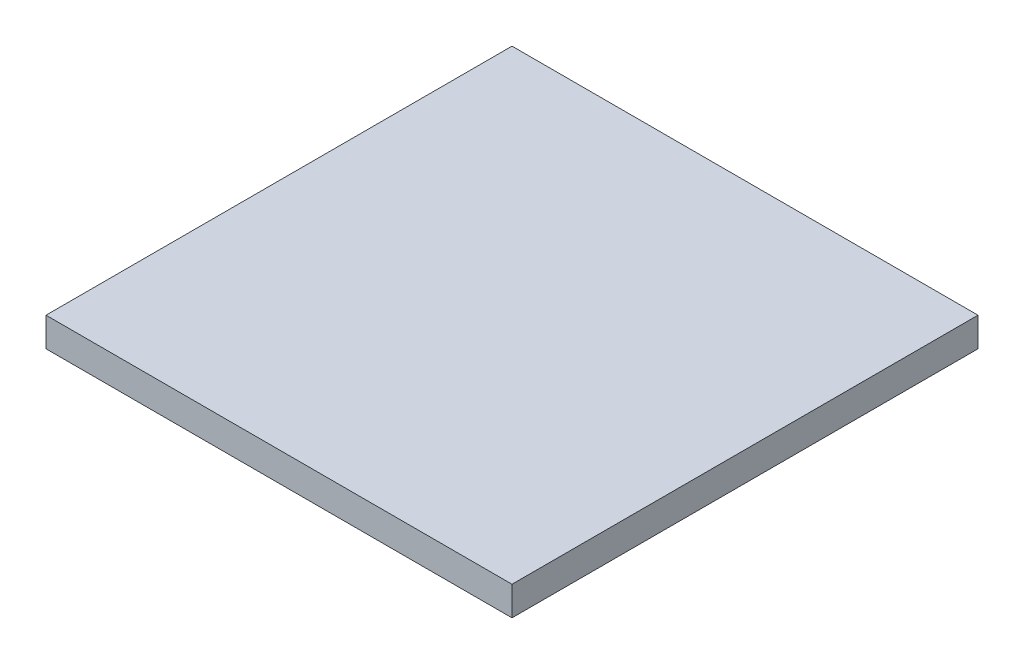
ISO-10303-21;
HEADER;
FILE_DESCRIPTION(('STEP AP214'),'2;1');
FILE_NAME('part.step','',(''),(''),'','','');
FILE_SCHEMA(('AUTOMOTIVE_DESIGN { 1 0 10303 214 1 1 1 1 }'));
ENDSEC;
DATA;
#1=APPLICATION_CONTEXT('core data for automotive mechanical design processes');
#2=APPLICATION_PROTOCOL_DEFINITION('international standard','automotive_design',2000,#1);
#3=PRODUCT_CONTEXT('',#1,'mechanical');
#4=PRODUCT('Part','Part','',(#3));
#5=PRODUCT_RELATED_PRODUCT_CATEGORY('part','',(#4));
#6=PRODUCT_DEFINITION_FORMATION('','',#4);
#7=PRODUCT_DEFINITION_CONTEXT('part definition',#1,'design');
#8=PRODUCT_DEFINITION('design','',#6,#7);
#9=PRODUCT_DEFINITION_SHAPE('','',#8);
#10=(LENGTH_UNIT() NAMED_UNIT(*) SI_UNIT(.MILLI.,.METRE.));
#11=(NAMED_UNIT(*) PLANE_ANGLE_UNIT() SI_UNIT($,.RADIAN.));
#12=(NAMED_UNIT(*) SI_UNIT($,.STERADIAN.) SOLID_ANGLE_UNIT());
#13=UNCERTAINTY_MEASURE_WITH_UNIT(LENGTH_MEASURE(1.E-05),#10,'distance_accuracy_value','');
#14=(GEOMETRIC_REPRESENTATION_CONTEXT(3) GLOBAL_UNCERTAINTY_ASSIGNED_CONTEXT((#13)) GLOBAL_UNIT_ASSIGNED_CONTEXT((#10,
#11,#12)) REPRESENTATION_CONTEXT('',''));
#15=CARTESIAN_POINT('',(0.,0.,0.));
#16=DIRECTION('',(0.,0.,1.));
#17=DIRECTION('',(1.,0.,0.));
#18=AXIS2_PLACEMENT_3D('',#15,#16,#17);
#19=CARTESIAN_POINT('',(-80.,-10.,80.));
#20=DIRECTION('',(-1.,0.,0.));
#21=DIRECTION('',(0.,0.,1.));
#22=AXIS2_PLACEMENT_3D('',#19,#20,#21);
#23=PLANE('',#22);
#24=DIRECTION('',(0.,0.,1.));
#25=VECTOR('',#24,1.);
#26=CARTESIAN_POINT('',(-80.,0.,80.));
#27=LINE('',#26,#25);
#28=CARTESIAN_POINT('',(-80.,0.,-80.));
#29=VERTEX_POINT('',#28);
#30=CARTESIAN_POINT('',(-80.,0.,80.));
#31=VERTEX_POINT('',#30);
#32=EDGE_CURVE('E103',#29,#31,#27,.T.);
#33=ORIENTED_EDGE('',*,*,#32,.F.);
#34=DIRECTION('',(0.,1.,0.));
#35=VECTOR('',#34,1.);
#36=CARTESIAN_POINT('',(-80.,-10.,-80.));
#37=LINE('',#36,#35);
#38=CARTESIAN_POINT('',(-80.,-10.,-80.));
#39=VERTEX_POINT('',#38);
#40=EDGE_CURVE('E11',#39,#29,#37,.T.);
#41=ORIENTED_EDGE('',*,*,#40,.F.);
#42=DIRECTION('',(0.,0.,1.));
#43=VECTOR('',#42,1.);
#44=CARTESIAN_POINT('',(-80.,-10.,80.));
#45=LINE('',#44,#43);
#46=CARTESIAN_POINT('',(-80.,-10.,80.));
#47=VERTEX_POINT('',#46);
#48=EDGE_CURVE('E97',#39,#47,#45,.T.);
#49=ORIENTED_EDGE('',*,*,#48,.T.);
#50=DIRECTION('',(0.,1.,0.));
#51=VECTOR('',#50,1.);
#52=CARTESIAN_POINT('',(-80.,-10.,80.));
#53=LINE('',#52,#51);
#54=EDGE_CURVE('E42',#47,#31,#53,.T.);
#55=ORIENTED_EDGE('',*,*,#54,.T.);
#56=EDGE_LOOP('',(#33,#41,#49,#55));
#57=FACE_BOUND('',#56,.T.);
#58=ADVANCED_FACE('F39',(#57),#23,.T.);
#59=CARTESIAN_POINT('',(80.,-10.,-80.));
#60=DIRECTION('',(0.,0.,-1.));
#61=DIRECTION('',(-1.,0.,0.));
#62=AXIS2_PLACEMENT_3D('',#59,#60,#61);
#63=PLANE('',#62);
#64=DIRECTION('',(-1.,0.,0.));
#65=VECTOR('',#64,1.);
#66=CARTESIAN_POINT('',(80.,0.,-80.));
#67=LINE('',#66,#65);
#68=CARTESIAN_POINT('',(80.,0.,-80.));
#69=VERTEX_POINT('',#68);
#70=EDGE_CURVE('E99',#69,#29,#67,.T.);
#71=ORIENTED_EDGE('',*,*,#70,.F.);
#72=DIRECTION('',(0.,1.,0.));
#73=VECTOR('',#72,1.);
#74=CARTESIAN_POINT('',(80.,-10.,-80.));
#75=LINE('',#74,#73);
#76=CARTESIAN_POINT('',(80.,-10.,-80.));
#77=VERTEX_POINT('',#76);
#78=EDGE_CURVE('E48',#77,#69,#75,.T.);
#79=ORIENTED_EDGE('',*,*,#78,.F.);
#80=DIRECTION('',(-1.,0.,0.));
#81=VECTOR('',#80,1.);
#82=CARTESIAN_POINT('',(80.,-10.,-80.));
#83=LINE('',#82,#81);
#84=EDGE_CURVE('E94',#77,#39,#83,.T.);
#85=ORIENTED_EDGE('',*,*,#84,.T.);
#86=ORIENTED_EDGE('',*,*,#40,.T.);
#87=EDGE_LOOP('',(#71,#79,#85,#86));
#88=FACE_BOUND('',#87,.T.);
#89=ADVANCED_FACE('F113',(#88),#63,.T.);
#90=CARTESIAN_POINT('',(80.,-10.,80.));
#91=DIRECTION('',(1.,0.,0.));
#92=DIRECTION('',(0.,0.,-1.));
#93=AXIS2_PLACEMENT_3D('',#90,#91,#92);
#94=PLANE('',#93);
#95=DIRECTION('',(0.,0.,-1.));
#96=VECTOR('',#95,1.);
#97=CARTESIAN_POINT('',(80.,0.,80.));
#98=LINE('',#97,#96);
#99=CARTESIAN_POINT('',(80.,0.,80.));
#100=VERTEX_POINT('',#99);
#101=EDGE_CURVE('E89',#100,#69,#98,.T.);
#102=ORIENTED_EDGE('',*,*,#101,.F.);
#103=DIRECTION('',(0.,1.,0.));
#104=VECTOR('',#103,1.);
#105=CARTESIAN_POINT('',(80.,-10.,80.));
#106=LINE('',#105,#104);
#107=CARTESIAN_POINT('',(80.,-10.,80.));
#108=VERTEX_POINT('',#107);
#109=EDGE_CURVE('E84',#108,#100,#106,.T.);
#110=ORIENTED_EDGE('',*,*,#109,.F.);
#111=DIRECTION('',(0.,0.,-1.));
#112=VECTOR('',#111,1.);
#113=CARTESIAN_POINT('',(80.,-10.,80.));
#114=LINE('',#113,#112);
#115=EDGE_CURVE('E87',#108,#77,#114,.T.);
#116=ORIENTED_EDGE('',*,*,#115,.T.);
#117=ORIENTED_EDGE('',*,*,#78,.T.);
#118=EDGE_LOOP('',(#102,#110,#116,#117));
#119=FACE_BOUND('',#118,.T.);
#120=ADVANCED_FACE('F86',(#119),#94,.T.);
#121=CARTESIAN_POINT('',(80.,-10.,80.));
#122=DIRECTION('',(0.,0.,1.));
#123=DIRECTION('',(1.,0.,0.));
#124=AXIS2_PLACEMENT_3D('',#121,#122,#123);
#125=PLANE('',#124);
#126=DIRECTION('',(1.,0.,0.));
#127=VECTOR('',#126,1.);
#128=CARTESIAN_POINT('',(80.,0.,80.));
#129=LINE('',#128,#127);
#130=EDGE_CURVE('E106',#31,#100,#129,.T.);
#131=ORIENTED_EDGE('',*,*,#130,.F.);
#132=ORIENTED_EDGE('',*,*,#54,.F.);
#133=DIRECTION('',(1.,0.,0.));
#134=VECTOR('',#133,1.);
#135=CARTESIAN_POINT('',(80.,-10.,80.));
#136=LINE('',#135,#134);
#137=EDGE_CURVE('E93',#47,#108,#136,.T.);
#138=ORIENTED_EDGE('',*,*,#137,.T.);
#139=ORIENTED_EDGE('',*,*,#109,.T.);
#140=EDGE_LOOP('',(#131,#132,#138,#139));
#141=FACE_BOUND('',#140,.T.);
#142=ADVANCED_FACE('F96',(#141),#125,.T.);
#143=CARTESIAN_POINT('',(0.,-10.,0.));
#144=DIRECTION('',(0.,1.,0.));
#145=DIRECTION('',(0.,0.,1.));
#146=AXIS2_PLACEMENT_3D('',#143,#144,#145);
#147=PLANE('',#146);
#148=ORIENTED_EDGE('',*,*,#48,.F.);
#149=ORIENTED_EDGE('',*,*,#84,.F.);
#150=ORIENTED_EDGE('',*,*,#115,.F.);
#151=ORIENTED_EDGE('',*,*,#137,.F.);
#152=EDGE_LOOP('',(#148,#149,#150,#151));
#153=FACE_BOUND('',#152,.T.);
#154=ADVANCED_FACE('F92',(#153),#147,.F.);
#155=CARTESIAN_POINT('',(0.,0.,0.));
#156=DIRECTION('',(0.,1.,0.));
#157=DIRECTION('',(0.,0.,1.));
#158=AXIS2_PLACEMENT_3D('',#155,#156,#157);
#159=PLANE('',#158);
#160=ORIENTED_EDGE('',*,*,#32,.T.);
#161=ORIENTED_EDGE('',*,*,#130,.T.);
#162=ORIENTED_EDGE('',*,*,#101,.T.);
#163=ORIENTED_EDGE('',*,*,#70,.T.);
#164=EDGE_LOOP('',(#160,#161,#162,#163));
#165=FACE_BOUND('',#164,.T.);
#166=ADVANCED_FACE('F112',(#165),#159,.T.);
#167=CLOSED_SHELL('',(#58,#89,#120,#142,#154,#166));
#168=MANIFOLD_SOLID_BREP('B2',#167);
#169=ADVANCED_BREP_SHAPE_REPRESENTATION('',(#18,#168),#14);
#170=SHAPE_DEFINITION_REPRESENTATION(#9,#169);
ENDSEC;
END-ISO-10303-21;
